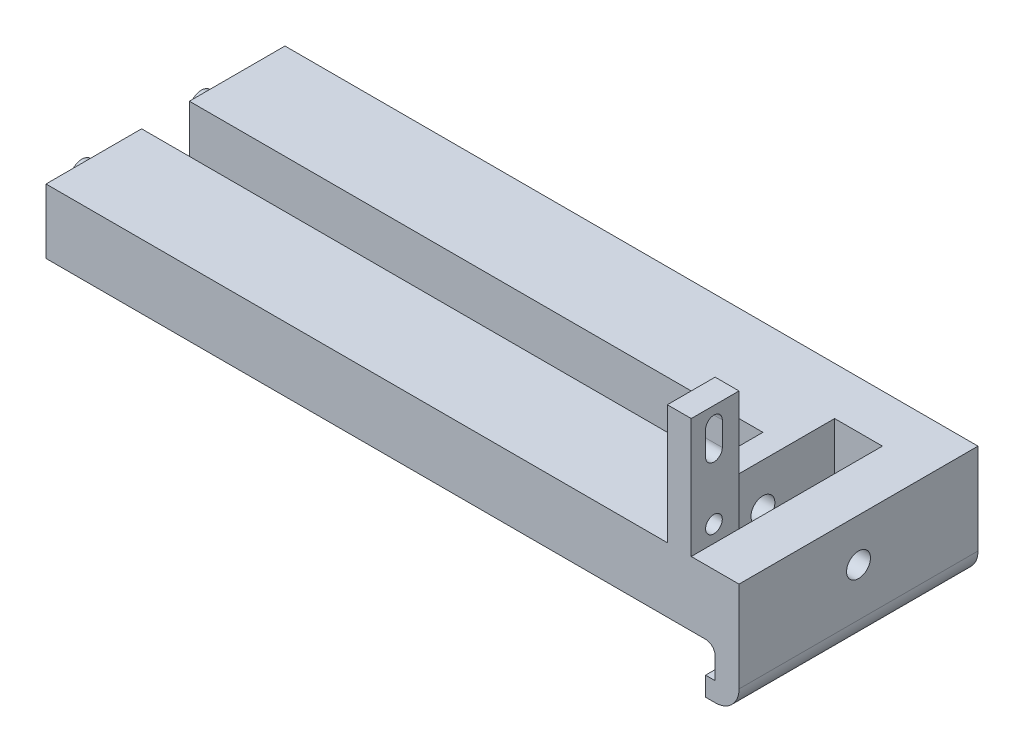
ISO-10303-21;
HEADER;
FILE_DESCRIPTION(('STEP AP214'),'2;1');
FILE_NAME('part.step','',(''),(''),'','','');
FILE_SCHEMA(('AUTOMOTIVE_DESIGN { 1 0 10303 214 1 1 1 1 }'));
ENDSEC;
DATA;
#1=APPLICATION_CONTEXT('core data for automotive mechanical design processes');
#2=APPLICATION_PROTOCOL_DEFINITION('international standard','automotive_design',2000,#1);
#3=PRODUCT_CONTEXT('',#1,'mechanical');
#4=PRODUCT('Part','Part','',(#3));
#5=PRODUCT_RELATED_PRODUCT_CATEGORY('part','',(#4));
#6=PRODUCT_DEFINITION_FORMATION('','',#4);
#7=PRODUCT_DEFINITION_CONTEXT('part definition',#1,'design');
#8=PRODUCT_DEFINITION('design','',#6,#7);
#9=PRODUCT_DEFINITION_SHAPE('','',#8);
#10=(LENGTH_UNIT() NAMED_UNIT(*) SI_UNIT(.MILLI.,.METRE.));
#11=(NAMED_UNIT(*) PLANE_ANGLE_UNIT() SI_UNIT($,.RADIAN.));
#12=(NAMED_UNIT(*) SI_UNIT($,.STERADIAN.) SOLID_ANGLE_UNIT());
#13=UNCERTAINTY_MEASURE_WITH_UNIT(LENGTH_MEASURE(1.E-05),#10,'distance_accuracy_value','');
#14=(GEOMETRIC_REPRESENTATION_CONTEXT(3) GLOBAL_UNCERTAINTY_ASSIGNED_CONTEXT((#13)) GLOBAL_UNIT_ASSIGNED_CONTEXT((#10,
#11,#12)) REPRESENTATION_CONTEXT('',''));
#15=CARTESIAN_POINT('',(0.,0.,0.));
#16=DIRECTION('',(0.,0.,1.));
#17=DIRECTION('',(1.,0.,0.));
#18=AXIS2_PLACEMENT_3D('',#15,#16,#17);
#19=CARTESIAN_POINT('',(-140.,13.5,50.));
#20=DIRECTION('',(0.,-1.,0.));
#21=DIRECTION('',(0.,0.,-1.));
#22=AXIS2_PLACEMENT_3D('',#19,#20,#21);
#23=PLANE('',#22);
#24=DIRECTION('',(0.,0.,-1.));
#25=VECTOR('',#24,1.);
#26=CARTESIAN_POINT('',(-5.,13.5,40.));
#27=LINE('',#26,#25);
#28=CARTESIAN_POINT('',(-5.,13.5,50.));
#29=VERTEX_POINT('',#28);
#30=CARTESIAN_POINT('',(-5.,13.5,40.));
#31=VERTEX_POINT('',#30);
#32=EDGE_CURVE('E416',#29,#31,#27,.T.);
#33=ORIENTED_EDGE('',*,*,#32,.F.);
#34=DIRECTION('',(-1.,0.,0.));
#35=VECTOR('',#34,1.);
#36=CARTESIAN_POINT('',(-140.,13.5,50.));
#37=LINE('',#36,#35);
#38=CARTESIAN_POINT('',(5.,13.5,50.));
#39=VERTEX_POINT('',#38);
#40=EDGE_CURVE('E289',#39,#29,#37,.T.);
#41=ORIENTED_EDGE('',*,*,#40,.F.);
#42=DIRECTION('',(0.,0.,1.));
#43=VECTOR('',#42,1.);
#44=CARTESIAN_POINT('',(5.,13.5,0.));
#45=LINE('',#44,#43);
#46=CARTESIAN_POINT('',(5.,13.5,0.));
#47=VERTEX_POINT('',#46);
#48=EDGE_CURVE('E266',#47,#39,#45,.T.);
#49=ORIENTED_EDGE('',*,*,#48,.F.);
#50=DIRECTION('',(-1.,0.,0.));
#51=VECTOR('',#50,1.);
#52=CARTESIAN_POINT('',(-140.,13.5,0.));
#53=LINE('',#52,#51);
#54=CARTESIAN_POINT('',(-140.,13.5,0.));
#55=VERTEX_POINT('',#54);
#56=EDGE_CURVE('E264',#47,#55,#53,.T.);
#57=ORIENTED_EDGE('',*,*,#56,.T.);
#58=DIRECTION('',(0.,0.,-1.));
#59=VECTOR('',#58,1.);
#60=CARTESIAN_POINT('',(-140.,13.5,50.));
#61=LINE('',#60,#59);
#62=CARTESIAN_POINT('',(-140.,13.5,20.));
#63=VERTEX_POINT('',#62);
#64=EDGE_CURVE('E309',#63,#55,#61,.T.);
#65=ORIENTED_EDGE('',*,*,#64,.F.);
#66=DIRECTION('',(-1.,0.,0.));
#67=VECTOR('',#66,1.);
#68=CARTESIAN_POINT('',(-140.,13.5,20.));
#69=LINE('',#68,#67);
#70=CARTESIAN_POINT('',(-20.,13.5,20.));
#71=VERTEX_POINT('',#70);
#72=EDGE_CURVE('E458',#71,#63,#69,.T.);
#73=ORIENTED_EDGE('',*,*,#72,.F.);
#74=DIRECTION('',(0.,0.,-1.));
#75=VECTOR('',#74,1.);
#76=CARTESIAN_POINT('',(-20.,13.5,30.));
#77=LINE('',#76,#75);
#78=CARTESIAN_POINT('',(-20.,13.5,30.));
#79=VERTEX_POINT('',#78);
#80=EDGE_CURVE('E455',#79,#71,#77,.T.);
#81=ORIENTED_EDGE('',*,*,#80,.F.);
#82=DIRECTION('',(1.,0.,0.));
#83=VECTOR('',#82,1.);
#84=CARTESIAN_POINT('',(-140.,13.5,30.));
#85=LINE('',#84,#83);
#86=CARTESIAN_POINT('',(-140.,13.5,30.));
#87=VERTEX_POINT('',#86);
#88=EDGE_CURVE('E429',#87,#79,#85,.T.);
#89=ORIENTED_EDGE('',*,*,#88,.F.);
#90=CARTESIAN_POINT('',(-140.,13.5,50.));
#91=VERTEX_POINT('',#90);
#92=EDGE_CURVE('E310',#91,#87,#61,.T.);
#93=ORIENTED_EDGE('',*,*,#92,.F.);
#94=CARTESIAN_POINT('',(-10.,13.5,50.));
#95=VERTEX_POINT('',#94);
#96=EDGE_CURVE('E293',#95,#91,#37,.T.);
#97=ORIENTED_EDGE('',*,*,#96,.F.);
#98=DIRECTION('',(0.,0.,1.));
#99=VECTOR('',#98,1.);
#100=CARTESIAN_POINT('',(-10.,13.5,40.));
#101=LINE('',#100,#99);
#102=CARTESIAN_POINT('',(-10.,13.5,40.));
#103=VERTEX_POINT('',#102);
#104=EDGE_CURVE('E436',#103,#95,#101,.T.);
#105=ORIENTED_EDGE('',*,*,#104,.F.);
#106=DIRECTION('',(-1.,0.,0.));
#107=VECTOR('',#106,1.);
#108=CARTESIAN_POINT('',(-140.,13.5,40.));
#109=LINE('',#108,#107);
#110=CARTESIAN_POINT('',(-15.,13.5,40.));
#111=VERTEX_POINT('',#110);
#112=EDGE_CURVE('E408',#103,#111,#109,.T.);
#113=ORIENTED_EDGE('',*,*,#112,.T.);
#114=DIRECTION('',(0.,0.,-1.));
#115=VECTOR('',#114,1.);
#116=CARTESIAN_POINT('',(-15.,13.5,50.));
#117=LINE('',#116,#115);
#118=CARTESIAN_POINT('',(-15.,13.5,10.));
#119=VERTEX_POINT('',#118);
#120=EDGE_CURVE('E406',#111,#119,#117,.T.);
#121=ORIENTED_EDGE('',*,*,#120,.T.);
#122=DIRECTION('',(1.,0.,0.));
#123=VECTOR('',#122,1.);
#124=CARTESIAN_POINT('',(-140.,13.5,10.));
#125=LINE('',#124,#123);
#126=CARTESIAN_POINT('',(-5.,13.5,10.));
#127=VERTEX_POINT('',#126);
#128=EDGE_CURVE('E396',#119,#127,#125,.T.);
#129=ORIENTED_EDGE('',*,*,#128,.T.);
#130=DIRECTION('',(0.,0.,1.));
#131=VECTOR('',#130,1.);
#132=CARTESIAN_POINT('',(-5.,13.5,50.));
#133=LINE('',#132,#131);
#134=EDGE_CURVE('E273',#127,#31,#133,.T.);
#135=ORIENTED_EDGE('',*,*,#134,.T.);
#136=EDGE_LOOP('',(#33,#41,#49,#57,#65,#73,#81,#89,#93,#97,#105,#113,#121,#129,#135));
#137=FACE_BOUND('',#136,.T.);
#138=ADVANCED_FACE('F33',(#137),#23,.F.);
#139=CARTESIAN_POINT('',(-140.,0.,50.));
#140=DIRECTION('',(1.,0.,0.));
#141=DIRECTION('',(0.,0.,-1.));
#142=AXIS2_PLACEMENT_3D('',#139,#140,#141);
#143=PLANE('',#142);
#144=CARTESIAN_POINT('',(-140.,6.75,12.5));
#145=DIRECTION('',(1.,0.,0.));
#146=DIRECTION('',(0.,0.,-1.));
#147=AXIS2_PLACEMENT_3D('',#144,#145,#146);
#148=CIRCLE('',#147,2.5);
#149=CARTESIAN_POINT('',(-140.,6.75,10.));
#150=VERTEX_POINT('',#149);
#151=EDGE_CURVE('E313',#150,#150,#148,.F.);
#152=ORIENTED_EDGE('',*,*,#151,.F.);
#153=EDGE_LOOP('',(#152));
#154=FACE_BOUND('',#153,.T.);
#155=DIRECTION('',(0.,0.,-1.));
#156=VECTOR('',#155,1.);
#157=CARTESIAN_POINT('',(-140.,0.,50.));
#158=LINE('',#157,#156);
#159=CARTESIAN_POINT('',(-140.,0.,20.));
#160=VERTEX_POINT('',#159);
#161=CARTESIAN_POINT('',(-140.,0.,0.));
#162=VERTEX_POINT('',#161);
#163=EDGE_CURVE('E298',#160,#162,#158,.T.);
#164=ORIENTED_EDGE('',*,*,#163,.F.);
#165=DIRECTION('',(0.,1.,0.));
#166=VECTOR('',#165,1.);
#167=CARTESIAN_POINT('',(-140.,-1.5,20.));
#168=LINE('',#167,#166);
#169=EDGE_CURVE('E341',#160,#63,#168,.T.);
#170=ORIENTED_EDGE('',*,*,#169,.T.);
#171=ORIENTED_EDGE('',*,*,#64,.T.);
#172=DIRECTION('',(0.,-1.,0.));
#173=VECTOR('',#172,1.);
#174=CARTESIAN_POINT('',(-140.,0.,0.));
#175=LINE('',#174,#173);
#176=EDGE_CURVE('E300',#55,#162,#175,.T.);
#177=ORIENTED_EDGE('',*,*,#176,.T.);
#178=EDGE_LOOP('',(#164,#170,#171,#177));
#179=FACE_BOUND('',#178,.T.);
#180=ADVANCED_FACE('F353',(#154,#179),#143,.F.);
#181=CARTESIAN_POINT('',(0.,0.,0.));
#182=DIRECTION('',(-1.,0.,0.));
#183=DIRECTION('',(0.,-1.,0.));
#184=AXIS2_PLACEMENT_3D('',#181,#182,#183);
#185=PLANE('',#184);
#186=DIRECTION('',(0.,-1.,0.));
#187=VECTOR('',#186,1.);
#188=CARTESIAN_POINT('',(0.,13.5,50.));
#189=LINE('',#188,#187);
#190=CARTESIAN_POINT('',(0.,-2.,50.));
#191=VERTEX_POINT('',#190);
#192=CARTESIAN_POINT('',(0.,-6.5,50.));
#193=VERTEX_POINT('',#192);
#194=EDGE_CURVE('E267',#191,#193,#189,.T.);
#195=ORIENTED_EDGE('',*,*,#194,.F.);
#196=DIRECTION('',(0.,0.,-1.));
#197=VECTOR('',#196,1.);
#198=CARTESIAN_POINT('',(0.,-2.,0.));
#199=LINE('',#198,#197);
#200=CARTESIAN_POINT('',(0.,-2.,0.));
#201=VERTEX_POINT('',#200);
#202=EDGE_CURVE('E233',#191,#201,#199,.T.);
#203=ORIENTED_EDGE('',*,*,#202,.T.);
#204=DIRECTION('',(0.,1.,0.));
#205=VECTOR('',#204,1.);
#206=CARTESIAN_POINT('',(0.,13.5,0.));
#207=LINE('',#206,#205);
#208=CARTESIAN_POINT('',(0.,-6.5,0.));
#209=VERTEX_POINT('',#208);
#210=EDGE_CURVE('E270',#209,#201,#207,.T.);
#211=ORIENTED_EDGE('',*,*,#210,.F.);
#212=DIRECTION('',(0.,0.,-1.));
#213=VECTOR('',#212,1.);
#214=CARTESIAN_POINT('',(0.,-6.5,0.));
#215=LINE('',#214,#213);
#216=EDGE_CURVE('E371',#193,#209,#215,.T.);
#217=ORIENTED_EDGE('',*,*,#216,.F.);
#218=EDGE_LOOP('',(#195,#203,#211,#217));
#219=FACE_BOUND('',#218,.T.);
#220=ADVANCED_FACE('F369',(#219),#185,.T.);
#221=CARTESIAN_POINT('',(-140.,6.75,37.5));
#222=DIRECTION('',(1.,0.,0.));
#223=DIRECTION('',(0.,0.,-1.));
#224=AXIS2_PLACEMENT_3D('',#221,#222,#223);
#225=CIRCLE('',#224,2.5);
#226=CARTESIAN_POINT('',(-140.,6.75,35.));
#227=VERTEX_POINT('',#226);
#228=EDGE_CURVE('E316',#227,#227,#225,.F.);
#229=ORIENTED_EDGE('',*,*,#228,.F.);
#230=EDGE_LOOP('',(#229));
#231=FACE_BOUND('',#230,.T.);
#232=ORIENTED_EDGE('',*,*,#92,.T.);
#233=DIRECTION('',(0.,1.,0.));
#234=VECTOR('',#233,1.);
#235=CARTESIAN_POINT('',(-140.,-1.5,30.));
#236=LINE('',#235,#234);
#237=CARTESIAN_POINT('',(-140.,0.,30.));
#238=VERTEX_POINT('',#237);
#239=EDGE_CURVE('E460',#238,#87,#236,.T.);
#240=ORIENTED_EDGE('',*,*,#239,.F.);
#241=CARTESIAN_POINT('',(-140.,0.,50.));
#242=VERTEX_POINT('',#241);
#243=EDGE_CURVE('E306',#242,#238,#158,.T.);
#244=ORIENTED_EDGE('',*,*,#243,.F.);
#245=DIRECTION('',(0.,-1.,0.));
#246=VECTOR('',#245,1.);
#247=CARTESIAN_POINT('',(-140.,0.,50.));
#248=LINE('',#247,#246);
#249=EDGE_CURVE('E292',#91,#242,#248,.T.);
#250=ORIENTED_EDGE('',*,*,#249,.F.);
#251=EDGE_LOOP('',(#232,#240,#244,#250));
#252=FACE_BOUND('',#251,.T.);
#253=ADVANCED_FACE('F489',(#231,#252),#143,.F.);
#254=CARTESIAN_POINT('',(0.,0.,50.));
#255=DIRECTION('',(0.,1.,0.));
#256=DIRECTION('',(0.,0.,1.));
#257=AXIS2_PLACEMENT_3D('',#254,#255,#256);
#258=PLANE('',#257);
#259=DIRECTION('',(1.,0.,0.));
#260=VECTOR('',#259,1.);
#261=CARTESIAN_POINT('',(0.,0.,40.));
#262=LINE('',#261,#260);
#263=CARTESIAN_POINT('',(-15.,0.,40.));
#264=VERTEX_POINT('',#263);
#265=CARTESIAN_POINT('',(-5.,0.,40.));
#266=VERTEX_POINT('',#265);
#267=EDGE_CURVE('E325',#264,#266,#262,.T.);
#268=ORIENTED_EDGE('',*,*,#267,.T.);
#269=DIRECTION('',(0.,0.,-1.));
#270=VECTOR('',#269,1.);
#271=CARTESIAN_POINT('',(-5.,0.,50.));
#272=LINE('',#271,#270);
#273=CARTESIAN_POINT('',(-5.,0.,10.));
#274=VERTEX_POINT('',#273);
#275=EDGE_CURVE('E328',#266,#274,#272,.T.);
#276=ORIENTED_EDGE('',*,*,#275,.T.);
#277=DIRECTION('',(-1.,0.,0.));
#278=VECTOR('',#277,1.);
#279=CARTESIAN_POINT('',(0.,0.,10.));
#280=LINE('',#279,#278);
#281=CARTESIAN_POINT('',(-15.,0.,10.));
#282=VERTEX_POINT('',#281);
#283=EDGE_CURVE('E319',#274,#282,#280,.T.);
#284=ORIENTED_EDGE('',*,*,#283,.T.);
#285=DIRECTION('',(0.,0.,1.));
#286=VECTOR('',#285,1.);
#287=CARTESIAN_POINT('',(-15.,0.,50.));
#288=LINE('',#287,#286);
#289=EDGE_CURVE('E322',#282,#264,#288,.T.);
#290=ORIENTED_EDGE('',*,*,#289,.T.);
#291=EDGE_LOOP('',(#268,#276,#284,#290));
#292=FACE_BOUND('',#291,.T.);
#293=DIRECTION('',(1.,0.,0.));
#294=VECTOR('',#293,1.);
#295=CARTESIAN_POINT('',(0.,0.,0.));
#296=LINE('',#295,#294);
#297=CARTESIAN_POINT('',(-2.,0.,0.));
#298=VERTEX_POINT('',#297);
#299=EDGE_CURVE('E303',#162,#298,#296,.T.);
#300=ORIENTED_EDGE('',*,*,#299,.T.);
#301=DIRECTION('',(0.,0.,-1.));
#302=VECTOR('',#301,1.);
#303=CARTESIAN_POINT('',(-2.,0.,50.));
#304=LINE('',#303,#302);
#305=CARTESIAN_POINT('',(-2.,0.,50.));
#306=VERTEX_POINT('',#305);
#307=EDGE_CURVE('E241',#298,#306,#304,.F.);
#308=ORIENTED_EDGE('',*,*,#307,.T.);
#309=DIRECTION('',(1.,0.,0.));
#310=VECTOR('',#309,1.);
#311=CARTESIAN_POINT('',(0.,0.,50.));
#312=LINE('',#311,#310);
#313=EDGE_CURVE('E295',#242,#306,#312,.T.);
#314=ORIENTED_EDGE('',*,*,#313,.F.);
#315=ORIENTED_EDGE('',*,*,#243,.T.);
#316=DIRECTION('',(1.,0.,0.));
#317=VECTOR('',#316,1.);
#318=CARTESIAN_POINT('',(0.,0.,30.));
#319=LINE('',#318,#317);
#320=CARTESIAN_POINT('',(-20.,0.,30.));
#321=VERTEX_POINT('',#320);
#322=EDGE_CURVE('E331',#238,#321,#319,.T.);
#323=ORIENTED_EDGE('',*,*,#322,.T.);
#324=DIRECTION('',(0.,0.,-1.));
#325=VECTOR('',#324,1.);
#326=CARTESIAN_POINT('',(-20.,0.,50.));
#327=LINE('',#326,#325);
#328=CARTESIAN_POINT('',(-20.,0.,20.));
#329=VERTEX_POINT('',#328);
#330=EDGE_CURVE('E340',#321,#329,#327,.T.);
#331=ORIENTED_EDGE('',*,*,#330,.T.);
#332=DIRECTION('',(-1.,0.,0.));
#333=VECTOR('',#332,1.);
#334=CARTESIAN_POINT('',(0.,0.,20.));
#335=LINE('',#334,#333);
#336=EDGE_CURVE('E212',#329,#160,#335,.T.);
#337=ORIENTED_EDGE('',*,*,#336,.T.);
#338=ORIENTED_EDGE('',*,*,#163,.T.);
#339=EDGE_LOOP('',(#300,#308,#314,#315,#323,#331,#337,#338));
#340=FACE_BOUND('',#339,.T.);
#341=ADVANCED_FACE('F347',(#292,#340),#258,.F.);
#342=CARTESIAN_POINT('',(0.,0.,50.));
#343=DIRECTION('',(0.,0.,-1.));
#344=DIRECTION('',(-1.,0.,0.));
#345=AXIS2_PLACEMENT_3D('',#342,#343,#344);
#346=PLANE('',#345);
#347=DIRECTION('',(-1.,0.,0.));
#348=VECTOR('',#347,1.);
#349=CARTESIAN_POINT('',(5.,-10.5,50.));
#350=LINE('',#349,#348);
#351=CARTESIAN_POINT('',(0.,-10.5,50.));
#352=VERTEX_POINT('',#351);
#353=CARTESIAN_POINT('',(-2.,-10.5,50.));
#354=VERTEX_POINT('',#353);
#355=EDGE_CURVE('E281',#352,#354,#350,.T.);
#356=ORIENTED_EDGE('',*,*,#355,.F.);
#357=CARTESIAN_POINT('',(0.,-5.50000000000001,50.));
#358=DIRECTION('',(0.,0.,-1.));
#359=DIRECTION('',(-1.,0.,0.));
#360=AXIS2_PLACEMENT_3D('',#357,#358,#359);
#361=CIRCLE('',#360,5.);
#362=CARTESIAN_POINT('',(5.,-5.50000000000001,50.));
#363=VERTEX_POINT('',#362);
#364=EDGE_CURVE('E11',#352,#363,#361,.F.);
#365=ORIENTED_EDGE('',*,*,#364,.T.);
#366=DIRECTION('',(0.,-1.,0.));
#367=VECTOR('',#366,1.);
#368=CARTESIAN_POINT('',(5.,13.5,50.));
#369=LINE('',#368,#367);
#370=EDGE_CURVE('E258',#39,#363,#369,.T.);
#371=ORIENTED_EDGE('',*,*,#370,.F.);
#372=ORIENTED_EDGE('',*,*,#40,.T.);
#373=DIRECTION('',(0.,-1.,0.));
#374=VECTOR('',#373,1.);
#375=CARTESIAN_POINT('',(-5.,38.5,50.));
#376=LINE('',#375,#374);
#377=CARTESIAN_POINT('',(-5.,38.5,50.));
#378=VERTEX_POINT('',#377);
#379=EDGE_CURVE('E435',#378,#29,#376,.T.);
#380=ORIENTED_EDGE('',*,*,#379,.F.);
#381=DIRECTION('',(1.,0.,0.));
#382=VECTOR('',#381,1.);
#383=CARTESIAN_POINT('',(-5.,38.5,50.));
#384=LINE('',#383,#382);
#385=CARTESIAN_POINT('',(-10.,38.5,50.));
#386=VERTEX_POINT('',#385);
#387=EDGE_CURVE('E444',#386,#378,#384,.T.);
#388=ORIENTED_EDGE('',*,*,#387,.F.);
#389=DIRECTION('',(0.,-1.,0.));
#390=VECTOR('',#389,1.);
#391=CARTESIAN_POINT('',(-10.,38.5,50.));
#392=LINE('',#391,#390);
#393=EDGE_CURVE('E448',#386,#95,#392,.T.);
#394=ORIENTED_EDGE('',*,*,#393,.T.);
#395=ORIENTED_EDGE('',*,*,#96,.T.);
#396=ORIENTED_EDGE('',*,*,#249,.T.);
#397=ORIENTED_EDGE('',*,*,#313,.T.);
#398=CARTESIAN_POINT('',(-2.,-2.,50.));
#399=DIRECTION('',(0.,0.,-1.));
#400=DIRECTION('',(-1.,0.,0.));
#401=AXIS2_PLACEMENT_3D('',#398,#399,#400);
#402=CIRCLE('',#401,2.);
#403=EDGE_CURVE('E245',#306,#191,#402,.T.);
#404=ORIENTED_EDGE('',*,*,#403,.T.);
#405=ORIENTED_EDGE('',*,*,#194,.T.);
#406=DIRECTION('',(1.,0.,0.));
#407=VECTOR('',#406,1.);
#408=CARTESIAN_POINT('',(-2.,-6.5,50.));
#409=LINE('',#408,#407);
#410=CARTESIAN_POINT('',(-2.,-6.5,50.));
#411=VERTEX_POINT('',#410);
#412=EDGE_CURVE('E387',#411,#193,#409,.T.);
#413=ORIENTED_EDGE('',*,*,#412,.F.);
#414=DIRECTION('',(0.,1.,0.));
#415=VECTOR('',#414,1.);
#416=CARTESIAN_POINT('',(-2.,-6.5,50.));
#417=LINE('',#416,#415);
#418=EDGE_CURVE('E468',#354,#411,#417,.T.);
#419=ORIENTED_EDGE('',*,*,#418,.F.);
#420=EDGE_LOOP('',(#356,#365,#371,#372,#380,#388,#394,#395,#396,#397,#404,#405,#413,#419));
#421=FACE_BOUND('',#420,.T.);
#422=ADVANCED_FACE('F364',(#421),#346,.F.);
#423=CARTESIAN_POINT('',(0.,0.,0.));
#424=DIRECTION('',(0.,0.,-1.));
#425=DIRECTION('',(-1.,0.,0.));
#426=AXIS2_PLACEMENT_3D('',#423,#424,#425);
#427=PLANE('',#426);
#428=DIRECTION('',(0.,1.,0.));
#429=VECTOR('',#428,1.);
#430=CARTESIAN_POINT('',(5.,13.5,0.));
#431=LINE('',#430,#429);
#432=CARTESIAN_POINT('',(5.,-5.5,0.));
#433=VERTEX_POINT('',#432);
#434=EDGE_CURVE('E255',#433,#47,#431,.T.);
#435=ORIENTED_EDGE('',*,*,#434,.F.);
#436=CARTESIAN_POINT('',(0.,-5.5,0.));
#437=DIRECTION('',(0.,0.,-1.));
#438=DIRECTION('',(-1.,0.,0.));
#439=AXIS2_PLACEMENT_3D('',#436,#437,#438);
#440=CIRCLE('',#439,5.);
#441=CARTESIAN_POINT('',(0.,-10.5,0.));
#442=VERTEX_POINT('',#441);
#443=EDGE_CURVE('E55',#433,#442,#440,.T.);
#444=ORIENTED_EDGE('',*,*,#443,.T.);
#445=DIRECTION('',(-1.,0.,0.));
#446=VECTOR('',#445,1.);
#447=CARTESIAN_POINT('',(5.,-10.5,0.));
#448=LINE('',#447,#446);
#449=CARTESIAN_POINT('',(-2.,-10.5,0.));
#450=VERTEX_POINT('',#449);
#451=EDGE_CURVE('E277',#442,#450,#448,.T.);
#452=ORIENTED_EDGE('',*,*,#451,.T.);
#453=DIRECTION('',(0.,-1.,0.));
#454=VECTOR('',#453,1.);
#455=CARTESIAN_POINT('',(-2.,-6.5,0.));
#456=LINE('',#455,#454);
#457=CARTESIAN_POINT('',(-2.,-6.5,0.));
#458=VERTEX_POINT('',#457);
#459=EDGE_CURVE('E375',#458,#450,#456,.T.);
#460=ORIENTED_EDGE('',*,*,#459,.F.);
#461=DIRECTION('',(1.,0.,0.));
#462=VECTOR('',#461,1.);
#463=CARTESIAN_POINT('',(-2.,-6.5,0.));
#464=LINE('',#463,#462);
#465=EDGE_CURVE('E385',#458,#209,#464,.T.);
#466=ORIENTED_EDGE('',*,*,#465,.T.);
#467=ORIENTED_EDGE('',*,*,#210,.T.);
#468=CARTESIAN_POINT('',(-2.,-2.,0.));
#469=DIRECTION('',(0.,0.,-1.));
#470=DIRECTION('',(-1.,0.,0.));
#471=AXIS2_PLACEMENT_3D('',#468,#469,#470);
#472=CIRCLE('',#471,2.);
#473=EDGE_CURVE('E243',#201,#298,#472,.F.);
#474=ORIENTED_EDGE('',*,*,#473,.T.);
#475=ORIENTED_EDGE('',*,*,#299,.F.);
#476=ORIENTED_EDGE('',*,*,#176,.F.);
#477=ORIENTED_EDGE('',*,*,#56,.F.);
#478=EDGE_LOOP('',(#435,#444,#452,#460,#466,#467,#474,#475,#476,#477));
#479=FACE_BOUND('',#478,.T.);
#480=ADVANCED_FACE('F261',(#479),#427,.T.);
#481=CARTESIAN_POINT('',(-145.,6.75,12.5));
#482=DIRECTION('',(1.,0.,0.));
#483=DIRECTION('',(0.,0.,-1.));
#484=AXIS2_PLACEMENT_3D('',#481,#482,#483);
#485=CYLINDRICAL_SURFACE('',#484,2.5);
#486=CARTESIAN_POINT('',(-145.,6.75,12.5));
#487=DIRECTION('',(-1.,0.,0.));
#488=DIRECTION('',(0.,0.,1.));
#489=AXIS2_PLACEMENT_3D('',#486,#487,#488);
#490=CIRCLE('',#489,2.5);
#491=CARTESIAN_POINT('',(-145.,6.75,15.));
#492=VERTEX_POINT('',#491);
#493=EDGE_CURVE('E286',#492,#492,#490,.T.);
#494=ORIENTED_EDGE('',*,*,#493,.F.);
#495=EDGE_LOOP('',(#494));
#496=FACE_BOUND('',#495,.T.);
#497=ORIENTED_EDGE('',*,*,#151,.T.);
#498=EDGE_LOOP('',(#497));
#499=FACE_BOUND('',#498,.T.);
#500=ADVANCED_FACE('F498',(#496,#499),#485,.T.);
#501=CARTESIAN_POINT('',(-145.,6.75,12.5));
#502=DIRECTION('',(-1.,0.,0.));
#503=DIRECTION('',(0.,0.,1.));
#504=AXIS2_PLACEMENT_3D('',#501,#502,#503);
#505=PLANE('',#504);
#506=ORIENTED_EDGE('',*,*,#493,.T.);
#507=EDGE_LOOP('',(#506));
#508=FACE_BOUND('',#507,.T.);
#509=ADVANCED_FACE('F503',(#508),#505,.T.);
#510=CARTESIAN_POINT('',(-145.,6.75,37.5));
#511=DIRECTION('',(1.,0.,0.));
#512=DIRECTION('',(0.,0.,-1.));
#513=AXIS2_PLACEMENT_3D('',#510,#511,#512);
#514=CYLINDRICAL_SURFACE('',#513,2.5);
#515=CARTESIAN_POINT('',(-145.,6.75,37.5));
#516=DIRECTION('',(-1.,0.,0.));
#517=DIRECTION('',(0.,0.,1.));
#518=AXIS2_PLACEMENT_3D('',#515,#516,#517);
#519=CIRCLE('',#518,2.5);
#520=CARTESIAN_POINT('',(-145.,6.75,40.));
#521=VERTEX_POINT('',#520);
#522=EDGE_CURVE('E283',#521,#521,#519,.T.);
#523=ORIENTED_EDGE('',*,*,#522,.F.);
#524=EDGE_LOOP('',(#523));
#525=FACE_BOUND('',#524,.T.);
#526=ORIENTED_EDGE('',*,*,#228,.T.);
#527=EDGE_LOOP('',(#526));
#528=FACE_BOUND('',#527,.T.);
#529=ADVANCED_FACE('F507',(#525,#528),#514,.T.);
#530=CARTESIAN_POINT('',(-145.,6.75,37.5));
#531=DIRECTION('',(-1.,0.,0.));
#532=DIRECTION('',(0.,0.,1.));
#533=AXIS2_PLACEMENT_3D('',#530,#531,#532);
#534=PLANE('',#533);
#535=ORIENTED_EDGE('',*,*,#522,.T.);
#536=EDGE_LOOP('',(#535));
#537=FACE_BOUND('',#536,.T.);
#538=ADVANCED_FACE('F511',(#537),#534,.T.);
#539=CARTESIAN_POINT('',(5.,-10.5,0.));
#540=DIRECTION('',(0.,1.,0.));
#541=DIRECTION('',(0.,0.,1.));
#542=AXIS2_PLACEMENT_3D('',#539,#540,#541);
#543=PLANE('',#542);
#544=ORIENTED_EDGE('',*,*,#451,.F.);
#545=DIRECTION('',(0.,0.,-1.));
#546=VECTOR('',#545,1.);
#547=CARTESIAN_POINT('',(0.,-10.5,0.));
#548=LINE('',#547,#546);
#549=EDGE_CURVE('E41',#442,#352,#548,.F.);
#550=ORIENTED_EDGE('',*,*,#549,.T.);
#551=ORIENTED_EDGE('',*,*,#355,.T.);
#552=DIRECTION('',(0.,0.,1.));
#553=VECTOR('',#552,1.);
#554=CARTESIAN_POINT('',(-2.,-10.5,0.));
#555=LINE('',#554,#553);
#556=EDGE_CURVE('E378',#450,#354,#555,.T.);
#557=ORIENTED_EDGE('',*,*,#556,.F.);
#558=EDGE_LOOP('',(#544,#550,#551,#557));
#559=FACE_BOUND('',#558,.T.);
#560=ADVANCED_FACE('F476',(#559),#543,.F.);
#561=CARTESIAN_POINT('',(5.,0.,0.));
#562=DIRECTION('',(-1.,0.,0.));
#563=DIRECTION('',(0.,-1.,0.));
#564=AXIS2_PLACEMENT_3D('',#561,#562,#563);
#565=PLANE('',#564);
#566=CARTESIAN_POINT('',(5.,4.5,25.));
#567=DIRECTION('',(1.,0.,0.));
#568=DIRECTION('',(0.,1.,0.));
#569=AXIS2_PLACEMENT_3D('',#566,#567,#568);
#570=CIRCLE('',#569,2.5);
#571=CARTESIAN_POINT('',(5.,7.,25.));
#572=VERTEX_POINT('',#571);
#573=EDGE_CURVE('E336',#572,#572,#570,.T.);
#574=ORIENTED_EDGE('',*,*,#573,.F.);
#575=EDGE_LOOP('',(#574));
#576=FACE_BOUND('',#575,.T.);
#577=ORIENTED_EDGE('',*,*,#370,.T.);
#578=DIRECTION('',(0.,0.,-1.));
#579=VECTOR('',#578,1.);
#580=CARTESIAN_POINT('',(5.,-5.5,0.));
#581=LINE('',#580,#579);
#582=EDGE_CURVE('E247',#363,#433,#581,.T.);
#583=ORIENTED_EDGE('',*,*,#582,.T.);
#584=ORIENTED_EDGE('',*,*,#434,.T.);
#585=ORIENTED_EDGE('',*,*,#48,.T.);
#586=EDGE_LOOP('',(#577,#583,#584,#585));
#587=FACE_BOUND('',#586,.T.);
#588=ADVANCED_FACE('F253',(#576,#587),#565,.F.);
#589=CARTESIAN_POINT('',(-5.,-10.5,40.));
#590=DIRECTION('',(1.,0.,0.));
#591=DIRECTION('',(0.,0.,-1.));
#592=AXIS2_PLACEMENT_3D('',#589,#590,#591);
#593=PLANE('',#592);
#594=CARTESIAN_POINT('',(-5.,4.5,25.));
#595=DIRECTION('',(1.,0.,0.));
#596=DIRECTION('',(0.,0.,-1.));
#597=AXIS2_PLACEMENT_3D('',#594,#595,#596);
#598=CIRCLE('',#597,2.5);
#599=CARTESIAN_POINT('',(-5.,4.5,22.5));
#600=VERTEX_POINT('',#599);
#601=EDGE_CURVE('E335',#600,#600,#598,.T.);
#602=ORIENTED_EDGE('',*,*,#601,.T.);
#603=EDGE_LOOP('',(#602));
#604=FACE_BOUND('',#603,.T.);
#605=DIRECTION('',(0.,1.,0.));
#606=VECTOR('',#605,1.);
#607=CARTESIAN_POINT('',(-5.,-10.5,10.));
#608=LINE('',#607,#606);
#609=EDGE_CURVE('E393',#274,#127,#608,.T.);
#610=ORIENTED_EDGE('',*,*,#609,.F.);
#611=ORIENTED_EDGE('',*,*,#275,.F.);
#612=DIRECTION('',(0.,1.,0.));
#613=VECTOR('',#612,1.);
#614=CARTESIAN_POINT('',(-5.,-10.5,40.));
#615=LINE('',#614,#613);
#616=EDGE_CURVE('E394',#266,#31,#615,.T.);
#617=ORIENTED_EDGE('',*,*,#616,.T.);
#618=ORIENTED_EDGE('',*,*,#134,.F.);
#619=EDGE_LOOP('',(#610,#611,#617,#618));
#620=FACE_BOUND('',#619,.T.);
#621=ADVANCED_FACE('F522',(#604,#620),#593,.F.);
#622=CARTESIAN_POINT('',(-5.,-10.5,40.));
#623=DIRECTION('',(0.,0.,1.));
#624=DIRECTION('',(1.,0.,0.));
#625=AXIS2_PLACEMENT_3D('',#622,#623,#624);
#626=PLANE('',#625);
#627=ORIENTED_EDGE('',*,*,#616,.F.);
#628=ORIENTED_EDGE('',*,*,#267,.F.);
#629=DIRECTION('',(0.,1.,0.));
#630=VECTOR('',#629,1.);
#631=CARTESIAN_POINT('',(-15.,-10.5,40.));
#632=LINE('',#631,#630);
#633=EDGE_CURVE('E397',#264,#111,#632,.T.);
#634=ORIENTED_EDGE('',*,*,#633,.T.);
#635=ORIENTED_EDGE('',*,*,#112,.F.);
#636=DIRECTION('',(0.,-1.,0.));
#637=VECTOR('',#636,1.);
#638=CARTESIAN_POINT('',(-10.,38.5,40.));
#639=LINE('',#638,#637);
#640=CARTESIAN_POINT('',(-10.,38.5,40.));
#641=VERTEX_POINT('',#640);
#642=EDGE_CURVE('E430',#641,#103,#639,.T.);
#643=ORIENTED_EDGE('',*,*,#642,.F.);
#644=DIRECTION('',(-1.,0.,0.));
#645=VECTOR('',#644,1.);
#646=CARTESIAN_POINT('',(-5.,38.5,40.));
#647=LINE('',#646,#645);
#648=CARTESIAN_POINT('',(-5.,38.5,40.));
#649=VERTEX_POINT('',#648);
#650=EDGE_CURVE('E425',#649,#641,#647,.T.);
#651=ORIENTED_EDGE('',*,*,#650,.F.);
#652=DIRECTION('',(0.,-1.,0.));
#653=VECTOR('',#652,1.);
#654=CARTESIAN_POINT('',(-5.,38.5,40.));
#655=LINE('',#654,#653);
#656=EDGE_CURVE('E422',#649,#31,#655,.T.);
#657=ORIENTED_EDGE('',*,*,#656,.T.);
#658=EDGE_LOOP('',(#627,#628,#634,#635,#643,#651,#657));
#659=FACE_BOUND('',#658,.T.);
#660=ADVANCED_FACE('F423',(#659),#626,.F.);
#661=CARTESIAN_POINT('',(-15.,-10.5,40.));
#662=DIRECTION('',(-1.,0.,0.));
#663=DIRECTION('',(0.,0.,1.));
#664=AXIS2_PLACEMENT_3D('',#661,#662,#663);
#665=PLANE('',#664);
#666=CARTESIAN_POINT('',(-15.,4.5,25.));
#667=DIRECTION('',(-1.,0.,0.));
#668=DIRECTION('',(0.,0.,1.));
#669=AXIS2_PLACEMENT_3D('',#666,#667,#668);
#670=CIRCLE('',#669,2.5);
#671=CARTESIAN_POINT('',(-15.,4.5,27.5));
#672=VERTEX_POINT('',#671);
#673=EDGE_CURVE('E332',#672,#672,#670,.T.);
#674=ORIENTED_EDGE('',*,*,#673,.T.);
#675=EDGE_LOOP('',(#674));
#676=FACE_BOUND('',#675,.T.);
#677=ORIENTED_EDGE('',*,*,#633,.F.);
#678=ORIENTED_EDGE('',*,*,#289,.F.);
#679=DIRECTION('',(0.,1.,0.));
#680=VECTOR('',#679,1.);
#681=CARTESIAN_POINT('',(-15.,-10.5,10.));
#682=LINE('',#681,#680);
#683=EDGE_CURVE('E400',#282,#119,#682,.T.);
#684=ORIENTED_EDGE('',*,*,#683,.T.);
#685=ORIENTED_EDGE('',*,*,#120,.F.);
#686=EDGE_LOOP('',(#677,#678,#684,#685));
#687=FACE_BOUND('',#686,.T.);
#688=ADVANCED_FACE('F531',(#676,#687),#665,.F.);
#689=CARTESIAN_POINT('',(-5.,-10.5,10.));
#690=DIRECTION('',(0.,0.,-1.));
#691=DIRECTION('',(-1.,0.,0.));
#692=AXIS2_PLACEMENT_3D('',#689,#690,#691);
#693=PLANE('',#692);
#694=ORIENTED_EDGE('',*,*,#683,.F.);
#695=ORIENTED_EDGE('',*,*,#283,.F.);
#696=ORIENTED_EDGE('',*,*,#609,.T.);
#697=ORIENTED_EDGE('',*,*,#128,.F.);
#698=EDGE_LOOP('',(#694,#695,#696,#697));
#699=FACE_BOUND('',#698,.T.);
#700=ADVANCED_FACE('F527',(#699),#693,.F.);
#701=CARTESIAN_POINT('',(-30.,4.5,25.));
#702=DIRECTION('',(1.,0.,0.));
#703=DIRECTION('',(0.,1.,0.));
#704=AXIS2_PLACEMENT_3D('',#701,#702,#703);
#705=CYLINDRICAL_SURFACE('',#704,2.5);
#706=CARTESIAN_POINT('',(-20.,4.5,25.));
#707=DIRECTION('',(1.,0.,0.));
#708=DIRECTION('',(0.,0.,-1.));
#709=AXIS2_PLACEMENT_3D('',#706,#707,#708);
#710=CIRCLE('',#709,2.5);
#711=CARTESIAN_POINT('',(-20.,4.5,22.5));
#712=VERTEX_POINT('',#711);
#713=EDGE_CURVE('E337',#712,#712,#710,.F.);
#714=ORIENTED_EDGE('',*,*,#713,.T.);
#715=EDGE_LOOP('',(#714));
#716=FACE_BOUND('',#715,.T.);
#717=ORIENTED_EDGE('',*,*,#673,.F.);
#718=EDGE_LOOP('',(#717));
#719=FACE_BOUND('',#718,.T.);
#720=ADVANCED_FACE('F530',(#716,#719),#705,.F.);
#721=ORIENTED_EDGE('',*,*,#573,.T.);
#722=EDGE_LOOP('',(#721));
#723=FACE_BOUND('',#722,.T.);
#724=ORIENTED_EDGE('',*,*,#601,.F.);
#725=EDGE_LOOP('',(#724));
#726=FACE_BOUND('',#725,.T.);
#727=ADVANCED_FACE('F538',(#723,#726),#705,.F.);
#728=CARTESIAN_POINT('',(-2.,-6.5,0.));
#729=DIRECTION('',(0.,-1.,0.));
#730=DIRECTION('',(1.,0.,0.));
#731=AXIS2_PLACEMENT_3D('',#728,#729,#730);
#732=PLANE('',#731);
#733=ORIENTED_EDGE('',*,*,#216,.T.);
#734=ORIENTED_EDGE('',*,*,#465,.F.);
#735=DIRECTION('',(0.,0.,-1.));
#736=VECTOR('',#735,1.);
#737=CARTESIAN_POINT('',(-2.,-6.5,0.));
#738=LINE('',#737,#736);
#739=EDGE_CURVE('E383',#411,#458,#738,.T.);
#740=ORIENTED_EDGE('',*,*,#739,.F.);
#741=ORIENTED_EDGE('',*,*,#412,.T.);
#742=EDGE_LOOP('',(#733,#734,#740,#741));
#743=FACE_BOUND('',#742,.T.);
#744=ADVANCED_FACE('F474',(#743),#732,.F.);
#745=CARTESIAN_POINT('',(-2.,0.,0.));
#746=DIRECTION('',(-1.,0.,0.));
#747=DIRECTION('',(0.,-1.,0.));
#748=AXIS2_PLACEMENT_3D('',#745,#746,#747);
#749=PLANE('',#748);
#750=ORIENTED_EDGE('',*,*,#459,.T.);
#751=ORIENTED_EDGE('',*,*,#556,.T.);
#752=ORIENTED_EDGE('',*,*,#418,.T.);
#753=ORIENTED_EDGE('',*,*,#739,.T.);
#754=EDGE_LOOP('',(#750,#751,#752,#753));
#755=FACE_BOUND('',#754,.T.);
#756=ADVANCED_FACE('F472',(#755),#749,.T.);
#757=CARTESIAN_POINT('',(-140.,-1.5,20.));
#758=DIRECTION('',(0.,0.,-1.));
#759=DIRECTION('',(-1.,0.,0.));
#760=AXIS2_PLACEMENT_3D('',#757,#758,#759);
#761=PLANE('',#760);
#762=DIRECTION('',(0.,1.,0.));
#763=VECTOR('',#762,1.);
#764=CARTESIAN_POINT('',(-20.,-1.5,20.));
#765=LINE('',#764,#763);
#766=EDGE_CURVE('E462',#329,#71,#765,.T.);
#767=ORIENTED_EDGE('',*,*,#766,.T.);
#768=ORIENTED_EDGE('',*,*,#72,.T.);
#769=ORIENTED_EDGE('',*,*,#169,.F.);
#770=ORIENTED_EDGE('',*,*,#336,.F.);
#771=EDGE_LOOP('',(#767,#768,#769,#770));
#772=FACE_BOUND('',#771,.T.);
#773=ADVANCED_FACE('F546',(#772),#761,.F.);
#774=CARTESIAN_POINT('',(-140.,-1.5,30.));
#775=DIRECTION('',(0.,0.,1.));
#776=DIRECTION('',(1.,0.,0.));
#777=AXIS2_PLACEMENT_3D('',#774,#775,#776);
#778=PLANE('',#777);
#779=ORIENTED_EDGE('',*,*,#239,.T.);
#780=ORIENTED_EDGE('',*,*,#88,.T.);
#781=DIRECTION('',(0.,1.,0.));
#782=VECTOR('',#781,1.);
#783=CARTESIAN_POINT('',(-20.,-1.5,30.));
#784=LINE('',#783,#782);
#785=EDGE_CURVE('E464',#321,#79,#784,.T.);
#786=ORIENTED_EDGE('',*,*,#785,.F.);
#787=ORIENTED_EDGE('',*,*,#322,.F.);
#788=EDGE_LOOP('',(#779,#780,#786,#787));
#789=FACE_BOUND('',#788,.T.);
#790=ADVANCED_FACE('F547',(#789),#778,.F.);
#791=CARTESIAN_POINT('',(-20.,-1.5,30.));
#792=DIRECTION('',(1.,0.,0.));
#793=DIRECTION('',(0.,0.,-1.));
#794=AXIS2_PLACEMENT_3D('',#791,#792,#793);
#795=PLANE('',#794);
#796=ORIENTED_EDGE('',*,*,#713,.F.);
#797=EDGE_LOOP('',(#796));
#798=FACE_BOUND('',#797,.T.);
#799=ORIENTED_EDGE('',*,*,#785,.T.);
#800=ORIENTED_EDGE('',*,*,#80,.T.);
#801=ORIENTED_EDGE('',*,*,#766,.F.);
#802=ORIENTED_EDGE('',*,*,#330,.F.);
#803=EDGE_LOOP('',(#799,#800,#801,#802));
#804=FACE_BOUND('',#803,.T.);
#805=ADVANCED_FACE('F550',(#798,#804),#795,.F.);
#806=CARTESIAN_POINT('',(-5.,38.5,40.));
#807=DIRECTION('',(-1.,0.,0.));
#808=DIRECTION('',(0.,0.,1.));
#809=AXIS2_PLACEMENT_3D('',#806,#807,#808);
#810=PLANE('',#809);
#811=CARTESIAN_POINT('',(-5.,17.,45.2499999999999));
#812=DIRECTION('',(-1.,0.,0.));
#813=DIRECTION('',(0.,0.,1.));
#814=AXIS2_PLACEMENT_3D('',#811,#812,#813);
#815=CIRCLE('',#814,1.75);
#816=CARTESIAN_POINT('',(-5.,17.,46.9999999999999));
#817=VERTEX_POINT('',#816);
#818=EDGE_CURVE('E237',#817,#817,#815,.T.);
#819=ORIENTED_EDGE('',*,*,#818,.T.);
#820=EDGE_LOOP('',(#819));
#821=FACE_BOUND('',#820,.T.);
#822=DIRECTION('',(0.,-1.,0.));
#823=VECTOR('',#822,1.);
#824=CARTESIAN_POINT('',(-5.,38.5,43.4999999999999));
#825=LINE('',#824,#823);
#826=CARTESIAN_POINT('',(-5.,34.9999999999999,43.4999999999999));
#827=VERTEX_POINT('',#826);
#828=CARTESIAN_POINT('',(-5.,30.,43.4999999999999));
#829=VERTEX_POINT('',#828);
#830=EDGE_CURVE('E589',#827,#829,#825,.T.);
#831=ORIENTED_EDGE('',*,*,#830,.T.);
#832=CARTESIAN_POINT('',(-5.,30.,45.2499999999999));
#833=DIRECTION('',(-1.,0.,0.));
#834=DIRECTION('',(0.,0.,1.));
#835=AXIS2_PLACEMENT_3D('',#832,#833,#834);
#836=CIRCLE('',#835,1.75000000000001);
#837=CARTESIAN_POINT('',(-5.,30.,46.9999999999999));
#838=VERTEX_POINT('',#837);
#839=EDGE_CURVE('E238',#829,#838,#836,.T.);
#840=ORIENTED_EDGE('',*,*,#839,.T.);
#841=DIRECTION('',(0.,1.,0.));
#842=VECTOR('',#841,1.);
#843=CARTESIAN_POINT('',(-5.,38.5,46.9999999999999));
#844=LINE('',#843,#842);
#845=CARTESIAN_POINT('',(-5.,34.9999999999999,46.9999999999999));
#846=VERTEX_POINT('',#845);
#847=EDGE_CURVE('E593',#838,#846,#844,.T.);
#848=ORIENTED_EDGE('',*,*,#847,.T.);
#849=CARTESIAN_POINT('',(-5.,34.9999999999999,45.2499999999999));
#850=DIRECTION('',(-1.,0.,0.));
#851=DIRECTION('',(0.,0.,1.));
#852=AXIS2_PLACEMENT_3D('',#849,#850,#851);
#853=CIRCLE('',#852,1.75);
#854=EDGE_CURVE('E219',#846,#827,#853,.T.);
#855=ORIENTED_EDGE('',*,*,#854,.T.);
#856=EDGE_LOOP('',(#831,#840,#848,#855));
#857=FACE_BOUND('',#856,.T.);
#858=ORIENTED_EDGE('',*,*,#32,.T.);
#859=ORIENTED_EDGE('',*,*,#656,.F.);
#860=DIRECTION('',(0.,0.,-1.));
#861=VECTOR('',#860,1.);
#862=CARTESIAN_POINT('',(-5.,38.5,40.));
#863=LINE('',#862,#861);
#864=EDGE_CURVE('E439',#378,#649,#863,.T.);
#865=ORIENTED_EDGE('',*,*,#864,.F.);
#866=ORIENTED_EDGE('',*,*,#379,.T.);
#867=EDGE_LOOP('',(#858,#859,#865,#866));
#868=FACE_BOUND('',#867,.T.);
#869=ADVANCED_FACE('F433',(#821,#857,#868),#810,.F.);
#870=CARTESIAN_POINT('',(-10.,38.5,40.));
#871=DIRECTION('',(1.,0.,0.));
#872=DIRECTION('',(0.,0.,-1.));
#873=AXIS2_PLACEMENT_3D('',#870,#871,#872);
#874=PLANE('',#873);
#875=CARTESIAN_POINT('',(-10.,17.,45.2499999999999));
#876=DIRECTION('',(1.,0.,0.));
#877=DIRECTION('',(0.,0.,-1.));
#878=AXIS2_PLACEMENT_3D('',#875,#876,#877);
#879=CIRCLE('',#878,1.75);
#880=CARTESIAN_POINT('',(-10.,17.,43.4999999999999));
#881=VERTEX_POINT('',#880);
#882=EDGE_CURVE('E234',#881,#881,#879,.T.);
#883=ORIENTED_EDGE('',*,*,#882,.T.);
#884=EDGE_LOOP('',(#883));
#885=FACE_BOUND('',#884,.T.);
#886=DIRECTION('',(0.,-1.,0.));
#887=VECTOR('',#886,1.);
#888=CARTESIAN_POINT('',(-10.,38.5,46.9999999999999));
#889=LINE('',#888,#887);
#890=CARTESIAN_POINT('',(-10.,34.9999999999999,46.9999999999999));
#891=VERTEX_POINT('',#890);
#892=CARTESIAN_POINT('',(-10.,30.,46.9999999999999));
#893=VERTEX_POINT('',#892);
#894=EDGE_CURVE('E200',#891,#893,#889,.T.);
#895=ORIENTED_EDGE('',*,*,#894,.T.);
#896=CARTESIAN_POINT('',(-10.,30.,45.2499999999999));
#897=DIRECTION('',(1.,0.,0.));
#898=DIRECTION('',(0.,0.,-1.));
#899=AXIS2_PLACEMENT_3D('',#896,#897,#898);
#900=CIRCLE('',#899,1.75000000000001);
#901=CARTESIAN_POINT('',(-10.,30.,43.4999999999999));
#902=VERTEX_POINT('',#901);
#903=EDGE_CURVE('E228',#893,#902,#900,.T.);
#904=ORIENTED_EDGE('',*,*,#903,.T.);
#905=DIRECTION('',(0.,1.,0.));
#906=VECTOR('',#905,1.);
#907=CARTESIAN_POINT('',(-10.,38.5,43.4999999999999));
#908=LINE('',#907,#906);
#909=CARTESIAN_POINT('',(-10.,34.9999999999999,43.4999999999999));
#910=VERTEX_POINT('',#909);
#911=EDGE_CURVE('E226',#902,#910,#908,.T.);
#912=ORIENTED_EDGE('',*,*,#911,.T.);
#913=CARTESIAN_POINT('',(-10.,34.9999999999999,45.2499999999999));
#914=DIRECTION('',(1.,0.,0.));
#915=DIRECTION('',(0.,0.,-1.));
#916=AXIS2_PLACEMENT_3D('',#913,#914,#915);
#917=CIRCLE('',#916,1.75);
#918=EDGE_CURVE('E211',#910,#891,#917,.T.);
#919=ORIENTED_EDGE('',*,*,#918,.T.);
#920=EDGE_LOOP('',(#895,#904,#912,#919));
#921=FACE_BOUND('',#920,.T.);
#922=ORIENTED_EDGE('',*,*,#104,.T.);
#923=ORIENTED_EDGE('',*,*,#393,.F.);
#924=DIRECTION('',(0.,0.,1.));
#925=VECTOR('',#924,1.);
#926=CARTESIAN_POINT('',(-10.,38.5,40.));
#927=LINE('',#926,#925);
#928=EDGE_CURVE('E598',#641,#386,#927,.T.);
#929=ORIENTED_EDGE('',*,*,#928,.F.);
#930=ORIENTED_EDGE('',*,*,#642,.T.);
#931=EDGE_LOOP('',(#922,#923,#929,#930));
#932=FACE_BOUND('',#931,.T.);
#933=ADVANCED_FACE('F224',(#885,#921,#932),#874,.F.);
#934=CARTESIAN_POINT('',(0.,38.5,0.));
#935=DIRECTION('',(0.,-1.,0.));
#936=DIRECTION('',(0.,0.,-1.));
#937=AXIS2_PLACEMENT_3D('',#934,#935,#936);
#938=PLANE('',#937);
#939=ORIENTED_EDGE('',*,*,#864,.T.);
#940=ORIENTED_EDGE('',*,*,#650,.T.);
#941=ORIENTED_EDGE('',*,*,#928,.T.);
#942=ORIENTED_EDGE('',*,*,#387,.T.);
#943=EDGE_LOOP('',(#939,#940,#941,#942));
#944=FACE_BOUND('',#943,.T.);
#945=ADVANCED_FACE('F562',(#944),#938,.F.);
#946=CARTESIAN_POINT('',(5.00000000000001,30.,45.2499999999999));
#947=DIRECTION('',(-1.,0.,0.));
#948=DIRECTION('',(0.,0.,1.));
#949=AXIS2_PLACEMENT_3D('',#946,#947,#948);
#950=CYLINDRICAL_SURFACE('',#949,1.75000000000001);
#951=DIRECTION('',(-1.,0.,0.));
#952=VECTOR('',#951,1.);
#953=CARTESIAN_POINT('',(5.00000000000001,30.,43.4999999999999));
#954=LINE('',#953,#952);
#955=EDGE_CURVE('E615',#829,#902,#954,.T.);
#956=ORIENTED_EDGE('',*,*,#955,.T.);
#957=ORIENTED_EDGE('',*,*,#903,.F.);
#958=DIRECTION('',(-1.,0.,0.));
#959=VECTOR('',#958,1.);
#960=CARTESIAN_POINT('',(5.00000000000001,30.,46.9999999999999));
#961=LINE('',#960,#959);
#962=EDGE_CURVE('E206',#838,#893,#961,.T.);
#963=ORIENTED_EDGE('',*,*,#962,.F.);
#964=ORIENTED_EDGE('',*,*,#839,.F.);
#965=EDGE_LOOP('',(#956,#957,#963,#964));
#966=FACE_BOUND('',#965,.T.);
#967=ADVANCED_FACE('F566',(#966),#950,.F.);
#968=CARTESIAN_POINT('',(5.00000000000001,30.,43.4999999999999));
#969=DIRECTION('',(0.,0.,-1.));
#970=DIRECTION('',(-1.,0.,0.));
#971=AXIS2_PLACEMENT_3D('',#968,#969,#970);
#972=PLANE('',#971);
#973=DIRECTION('',(-1.,0.,0.));
#974=VECTOR('',#973,1.);
#975=CARTESIAN_POINT('',(5.00000000000001,34.9999999999999,43.4999999999999));
#976=LINE('',#975,#974);
#977=EDGE_CURVE('E221',#827,#910,#976,.T.);
#978=ORIENTED_EDGE('',*,*,#977,.T.);
#979=ORIENTED_EDGE('',*,*,#911,.F.);
#980=ORIENTED_EDGE('',*,*,#955,.F.);
#981=ORIENTED_EDGE('',*,*,#830,.F.);
#982=EDGE_LOOP('',(#978,#979,#980,#981));
#983=FACE_BOUND('',#982,.T.);
#984=ADVANCED_FACE('F570',(#983),#972,.F.);
#985=CARTESIAN_POINT('',(5.00000000000001,34.9999999999999,45.2499999999999));
#986=DIRECTION('',(-1.,0.,0.));
#987=DIRECTION('',(0.,0.,1.));
#988=AXIS2_PLACEMENT_3D('',#985,#986,#987);
#989=CYLINDRICAL_SURFACE('',#988,1.75);
#990=DIRECTION('',(-1.,0.,0.));
#991=VECTOR('',#990,1.);
#992=CARTESIAN_POINT('',(5.00000000000001,34.9999999999999,46.9999999999999));
#993=LINE('',#992,#991);
#994=EDGE_CURVE('E203',#846,#891,#993,.T.);
#995=ORIENTED_EDGE('',*,*,#994,.T.);
#996=ORIENTED_EDGE('',*,*,#918,.F.);
#997=ORIENTED_EDGE('',*,*,#977,.F.);
#998=ORIENTED_EDGE('',*,*,#854,.F.);
#999=EDGE_LOOP('',(#995,#996,#997,#998));
#1000=FACE_BOUND('',#999,.T.);
#1001=ADVANCED_FACE('F215',(#1000),#989,.F.);
#1002=CARTESIAN_POINT('',(5.00000000000001,34.9999999999999,46.9999999999999));
#1003=DIRECTION('',(0.,0.,1.));
#1004=DIRECTION('',(0.,-1.,0.));
#1005=AXIS2_PLACEMENT_3D('',#1002,#1003,#1004);
#1006=PLANE('',#1005);
#1007=ORIENTED_EDGE('',*,*,#962,.T.);
#1008=ORIENTED_EDGE('',*,*,#894,.F.);
#1009=ORIENTED_EDGE('',*,*,#994,.F.);
#1010=ORIENTED_EDGE('',*,*,#847,.F.);
#1011=EDGE_LOOP('',(#1007,#1008,#1009,#1010));
#1012=FACE_BOUND('',#1011,.T.);
#1013=ADVANCED_FACE('F202',(#1012),#1006,.F.);
#1014=CARTESIAN_POINT('',(5.00000000000001,17.,45.2499999999999));
#1015=DIRECTION('',(-1.,0.,0.));
#1016=DIRECTION('',(0.,0.,1.));
#1017=AXIS2_PLACEMENT_3D('',#1014,#1015,#1016);
#1018=CYLINDRICAL_SURFACE('',#1017,1.75);
#1019=ORIENTED_EDGE('',*,*,#882,.F.);
#1020=EDGE_LOOP('',(#1019));
#1021=FACE_BOUND('',#1020,.T.);
#1022=ORIENTED_EDGE('',*,*,#818,.F.);
#1023=EDGE_LOOP('',(#1022));
#1024=FACE_BOUND('',#1023,.T.);
#1025=ADVANCED_FACE('F481',(#1021,#1024),#1018,.F.);
#1026=CARTESIAN_POINT('',(-2.,-2.,0.));
#1027=DIRECTION('',(0.,0.,-1.));
#1028=DIRECTION('',(-1.,0.,0.));
#1029=AXIS2_PLACEMENT_3D('',#1026,#1027,#1028);
#1030=CYLINDRICAL_SURFACE('',#1029,2.);
#1031=ORIENTED_EDGE('',*,*,#403,.F.);
#1032=ORIENTED_EDGE('',*,*,#307,.F.);
#1033=ORIENTED_EDGE('',*,*,#473,.F.);
#1034=ORIENTED_EDGE('',*,*,#202,.F.);
#1035=EDGE_LOOP('',(#1031,#1032,#1033,#1034));
#1036=FACE_BOUND('',#1035,.T.);
#1037=ADVANCED_FACE('F360',(#1036),#1030,.F.);
#1038=CARTESIAN_POINT('',(0.,-5.5,0.));
#1039=DIRECTION('',(0.,0.,-1.));
#1040=DIRECTION('',(0.,1.,0.));
#1041=AXIS2_PLACEMENT_3D('',#1038,#1039,#1040);
#1042=CYLINDRICAL_SURFACE('',#1041,5.);
#1043=ORIENTED_EDGE('',*,*,#364,.F.);
#1044=ORIENTED_EDGE('',*,*,#549,.F.);
#1045=ORIENTED_EDGE('',*,*,#443,.F.);
#1046=ORIENTED_EDGE('',*,*,#582,.F.);
#1047=EDGE_LOOP('',(#1043,#1044,#1045,#1046));
#1048=FACE_BOUND('',#1047,.T.);
#1049=ADVANCED_FACE('F35',(#1048),#1042,.T.);
#1050=CLOSED_SHELL('',(#138,#180,#220,#253,#341,#422,#480,#500,#509,#529,#538,#560,#588,#621,
#660,#688,#700,#720,#727,#744,#756,#773,#790,#805,#869,#933,#945,#967,#984,#1001,#1013,#1025,
#1037,#1049));
#1051=MANIFOLD_SOLID_BREP('B2',#1050);
#1052=ADVANCED_BREP_SHAPE_REPRESENTATION('',(#18,#1051),#14);
#1053=SHAPE_DEFINITION_REPRESENTATION(#9,#1052);
ENDSEC;
END-ISO-10303-21;
